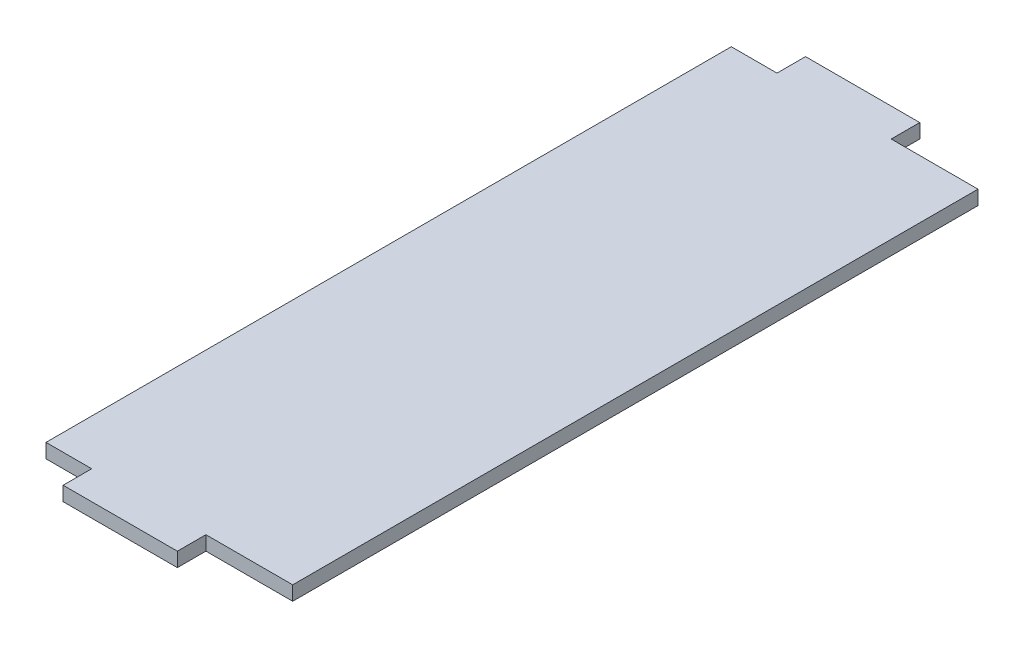
ISO-10303-21;
HEADER;
FILE_DESCRIPTION(('STEP AP214'),'2;1');
FILE_NAME('part.step','',(''),(''),'','','');
FILE_SCHEMA(('AUTOMOTIVE_DESIGN { 1 0 10303 214 1 1 1 1 }'));
ENDSEC;
DATA;
#1=APPLICATION_CONTEXT('core data for automotive mechanical design processes');
#2=APPLICATION_PROTOCOL_DEFINITION('international standard','automotive_design',2000,#1);
#3=PRODUCT_CONTEXT('',#1,'mechanical');
#4=PRODUCT('Part','Part','',(#3));
#5=PRODUCT_RELATED_PRODUCT_CATEGORY('part','',(#4));
#6=PRODUCT_DEFINITION_FORMATION('','',#4);
#7=PRODUCT_DEFINITION_CONTEXT('part definition',#1,'design');
#8=PRODUCT_DEFINITION('design','',#6,#7);
#9=PRODUCT_DEFINITION_SHAPE('','',#8);
#10=(LENGTH_UNIT() NAMED_UNIT(*) SI_UNIT(.MILLI.,.METRE.));
#11=(NAMED_UNIT(*) PLANE_ANGLE_UNIT() SI_UNIT($,.RADIAN.));
#12=(NAMED_UNIT(*) SI_UNIT($,.STERADIAN.) SOLID_ANGLE_UNIT());
#13=UNCERTAINTY_MEASURE_WITH_UNIT(LENGTH_MEASURE(1.E-05),#10,'distance_accuracy_value','');
#14=(GEOMETRIC_REPRESENTATION_CONTEXT(3) GLOBAL_UNCERTAINTY_ASSIGNED_CONTEXT((#13)) GLOBAL_UNIT_ASSIGNED_CONTEXT((#10,
#11,#12)) REPRESENTATION_CONTEXT('',''));
#15=CARTESIAN_POINT('',(0.,0.,0.));
#16=DIRECTION('',(0.,0.,1.));
#17=DIRECTION('',(1.,0.,0.));
#18=AXIS2_PLACEMENT_3D('',#15,#16,#17);
#19=CARTESIAN_POINT('',(0.,1.5875,0.));
#20=DIRECTION('',(0.,0.,-1.));
#21=DIRECTION('',(-1.,0.,0.));
#22=AXIS2_PLACEMENT_3D('',#19,#20,#21);
#23=PLANE('',#22);
#24=DIRECTION('',(1.,0.,0.));
#25=VECTOR('',#24,1.);
#26=CARTESIAN_POINT('',(0.,0.,0.));
#27=LINE('',#26,#25);
#28=CARTESIAN_POINT('',(0.,0.,0.));
#29=VERTEX_POINT('',#28);
#30=CARTESIAN_POINT('',(5.08,0.,0.));
#31=VERTEX_POINT('',#30);
#32=EDGE_CURVE('E154',#29,#31,#27,.T.);
#33=ORIENTED_EDGE('',*,*,#32,.T.);
#34=DIRECTION('',(0.,-1.,0.));
#35=VECTOR('',#34,1.);
#36=CARTESIAN_POINT('',(5.08,1.5875,0.));
#37=LINE('',#36,#35);
#38=CARTESIAN_POINT('',(5.08,1.5875,0.));
#39=VERTEX_POINT('',#38);
#40=EDGE_CURVE('E11',#39,#31,#37,.T.);
#41=ORIENTED_EDGE('',*,*,#40,.F.);
#42=DIRECTION('',(1.,0.,0.));
#43=VECTOR('',#42,1.);
#44=CARTESIAN_POINT('',(0.,1.5875,0.));
#45=LINE('',#44,#43);
#46=CARTESIAN_POINT('',(0.,1.5875,0.));
#47=VERTEX_POINT('',#46);
#48=EDGE_CURVE('E185',#47,#39,#45,.T.);
#49=ORIENTED_EDGE('',*,*,#48,.F.);
#50=DIRECTION('',(0.,-1.,0.));
#51=VECTOR('',#50,1.);
#52=CARTESIAN_POINT('',(0.,1.5875,0.));
#53=LINE('',#52,#51);
#54=EDGE_CURVE('E50',#47,#29,#53,.T.);
#55=ORIENTED_EDGE('',*,*,#54,.T.);
#56=EDGE_LOOP('',(#33,#41,#49,#55));
#57=FACE_BOUND('',#56,.T.);
#58=ADVANCED_FACE('F34',(#57),#23,.F.);
#59=CARTESIAN_POINT('',(5.08,1.5875,0.));
#60=DIRECTION('',(1.,0.,0.));
#61=DIRECTION('',(0.,0.,-1.));
#62=AXIS2_PLACEMENT_3D('',#59,#60,#61);
#63=PLANE('',#62);
#64=DIRECTION('',(0.,0.,1.));
#65=VECTOR('',#64,1.);
#66=CARTESIAN_POINT('',(5.08,0.,0.));
#67=LINE('',#66,#65);
#68=CARTESIAN_POINT('',(5.08,0.,3.175));
#69=VERTEX_POINT('',#68);
#70=EDGE_CURVE('E156',#31,#69,#67,.T.);
#71=ORIENTED_EDGE('',*,*,#70,.T.);
#72=DIRECTION('',(0.,-1.,0.));
#73=VECTOR('',#72,1.);
#74=CARTESIAN_POINT('',(5.08,1.5875,3.175));
#75=LINE('',#74,#73);
#76=CARTESIAN_POINT('',(5.08,1.5875,3.175));
#77=VERTEX_POINT('',#76);
#78=EDGE_CURVE('E42',#77,#69,#75,.T.);
#79=ORIENTED_EDGE('',*,*,#78,.F.);
#80=DIRECTION('',(0.,0.,1.));
#81=VECTOR('',#80,1.);
#82=CARTESIAN_POINT('',(5.08,1.5875,0.));
#83=LINE('',#82,#81);
#84=EDGE_CURVE('E100',#39,#77,#83,.T.);
#85=ORIENTED_EDGE('',*,*,#84,.F.);
#86=ORIENTED_EDGE('',*,*,#40,.T.);
#87=EDGE_LOOP('',(#71,#79,#85,#86));
#88=FACE_BOUND('',#87,.T.);
#89=ADVANCED_FACE('F246',(#88),#63,.F.);
#90=CARTESIAN_POINT('',(0.,1.5875,3.175));
#91=DIRECTION('',(0.,0.,-1.));
#92=DIRECTION('',(-1.,0.,0.));
#93=AXIS2_PLACEMENT_3D('',#90,#91,#92);
#94=PLANE('',#93);
#95=DIRECTION('',(1.,0.,0.));
#96=VECTOR('',#95,1.);
#97=CARTESIAN_POINT('',(0.,0.,3.175));
#98=LINE('',#97,#96);
#99=CARTESIAN_POINT('',(17.78,0.,3.175));
#100=VERTEX_POINT('',#99);
#101=EDGE_CURVE('E158',#69,#100,#98,.T.);
#102=ORIENTED_EDGE('',*,*,#101,.T.);
#103=DIRECTION('',(0.,-1.,0.));
#104=VECTOR('',#103,1.);
#105=CARTESIAN_POINT('',(17.78,1.5875,3.175));
#106=LINE('',#105,#104);
#107=CARTESIAN_POINT('',(17.78,1.5875,3.175));
#108=VERTEX_POINT('',#107);
#109=EDGE_CURVE('E199',#108,#100,#106,.T.);
#110=ORIENTED_EDGE('',*,*,#109,.F.);
#111=DIRECTION('',(1.,0.,0.));
#112=VECTOR('',#111,1.);
#113=CARTESIAN_POINT('',(0.,1.5875,3.175));
#114=LINE('',#113,#112);
#115=EDGE_CURVE('E206',#77,#108,#114,.T.);
#116=ORIENTED_EDGE('',*,*,#115,.F.);
#117=ORIENTED_EDGE('',*,*,#78,.T.);
#118=EDGE_LOOP('',(#102,#110,#116,#117));
#119=FACE_BOUND('',#118,.T.);
#120=ADVANCED_FACE('F204',(#119),#94,.F.);
#121=CARTESIAN_POINT('',(17.78,1.5875,0.));
#122=DIRECTION('',(1.,0.,0.));
#123=DIRECTION('',(0.,0.,-1.));
#124=AXIS2_PLACEMENT_3D('',#121,#122,#123);
#125=PLANE('',#124);
#126=DIRECTION('',(0.,0.,1.));
#127=VECTOR('',#126,1.);
#128=CARTESIAN_POINT('',(17.78,0.,0.));
#129=LINE('',#128,#127);
#130=CARTESIAN_POINT('',(17.78,0.,0.));
#131=VERTEX_POINT('',#130);
#132=EDGE_CURVE('E161',#131,#100,#129,.T.);
#133=ORIENTED_EDGE('',*,*,#132,.F.);
#134=DIRECTION('',(0.,-1.,0.));
#135=VECTOR('',#134,1.);
#136=CARTESIAN_POINT('',(17.78,1.5875,0.));
#137=LINE('',#136,#135);
#138=CARTESIAN_POINT('',(17.78,1.5875,0.));
#139=VERTEX_POINT('',#138);
#140=EDGE_CURVE('E197',#139,#131,#137,.T.);
#141=ORIENTED_EDGE('',*,*,#140,.F.);
#142=DIRECTION('',(0.,0.,1.));
#143=VECTOR('',#142,1.);
#144=CARTESIAN_POINT('',(17.78,1.5875,0.));
#145=LINE('',#144,#143);
#146=EDGE_CURVE('E216',#139,#108,#145,.T.);
#147=ORIENTED_EDGE('',*,*,#146,.T.);
#148=ORIENTED_EDGE('',*,*,#109,.T.);
#149=EDGE_LOOP('',(#133,#141,#147,#148));
#150=FACE_BOUND('',#149,.T.);
#151=ADVANCED_FACE('F212',(#150),#125,.T.);
#152=CARTESIAN_POINT('',(0.,1.5875,0.));
#153=DIRECTION('',(0.,0.,-1.));
#154=DIRECTION('',(-1.,0.,0.));
#155=AXIS2_PLACEMENT_3D('',#152,#153,#154);
#156=PLANE('',#155);
#157=DIRECTION('',(1.,0.,0.));
#158=VECTOR('',#157,1.);
#159=CARTESIAN_POINT('',(0.,0.,0.));
#160=LINE('',#159,#158);
#161=CARTESIAN_POINT('',(27.432,0.,0.));
#162=VERTEX_POINT('',#161);
#163=EDGE_CURVE('E164',#131,#162,#160,.T.);
#164=ORIENTED_EDGE('',*,*,#163,.T.);
#165=DIRECTION('',(0.,-1.,0.));
#166=VECTOR('',#165,1.);
#167=CARTESIAN_POINT('',(27.432,1.5875,0.));
#168=LINE('',#167,#166);
#169=CARTESIAN_POINT('',(27.432,1.5875,0.));
#170=VERTEX_POINT('',#169);
#171=EDGE_CURVE('E195',#170,#162,#168,.T.);
#172=ORIENTED_EDGE('',*,*,#171,.F.);
#173=DIRECTION('',(1.,0.,0.));
#174=VECTOR('',#173,1.);
#175=CARTESIAN_POINT('',(0.,1.5875,0.));
#176=LINE('',#175,#174);
#177=EDGE_CURVE('E217',#139,#170,#176,.T.);
#178=ORIENTED_EDGE('',*,*,#177,.F.);
#179=ORIENTED_EDGE('',*,*,#140,.T.);
#180=EDGE_LOOP('',(#164,#172,#178,#179));
#181=FACE_BOUND('',#180,.T.);
#182=ADVANCED_FACE('F259',(#181),#156,.F.);
#183=CARTESIAN_POINT('',(27.432,1.5875,0.));
#184=DIRECTION('',(1.,0.,0.));
#185=DIRECTION('',(0.,0.,-1.));
#186=AXIS2_PLACEMENT_3D('',#183,#184,#185);
#187=PLANE('',#186);
#188=DIRECTION('',(0.,0.,1.));
#189=VECTOR('',#188,1.);
#190=CARTESIAN_POINT('',(27.432,0.,0.));
#191=LINE('',#190,#189);
#192=CARTESIAN_POINT('',(27.432,0.,-76.2));
#193=VERTEX_POINT('',#192);
#194=EDGE_CURVE('E167',#193,#162,#191,.T.);
#195=ORIENTED_EDGE('',*,*,#194,.F.);
#196=DIRECTION('',(0.,-1.,0.));
#197=VECTOR('',#196,1.);
#198=CARTESIAN_POINT('',(27.432,1.5875,-76.2));
#199=LINE('',#198,#197);
#200=CARTESIAN_POINT('',(27.432,1.5875,-76.2));
#201=VERTEX_POINT('',#200);
#202=EDGE_CURVE('E193',#201,#193,#199,.T.);
#203=ORIENTED_EDGE('',*,*,#202,.F.);
#204=DIRECTION('',(0.,0.,1.));
#205=VECTOR('',#204,1.);
#206=CARTESIAN_POINT('',(27.432,1.5875,0.));
#207=LINE('',#206,#205);
#208=EDGE_CURVE('E219',#201,#170,#207,.T.);
#209=ORIENTED_EDGE('',*,*,#208,.T.);
#210=ORIENTED_EDGE('',*,*,#171,.T.);
#211=EDGE_LOOP('',(#195,#203,#209,#210));
#212=FACE_BOUND('',#211,.T.);
#213=ADVANCED_FACE('F262',(#212),#187,.T.);
#214=CARTESIAN_POINT('',(0.,1.5875,-76.2));
#215=DIRECTION('',(0.,0.,-1.));
#216=DIRECTION('',(-1.,0.,0.));
#217=AXIS2_PLACEMENT_3D('',#214,#215,#216);
#218=PLANE('',#217);
#219=DIRECTION('',(1.,0.,0.));
#220=VECTOR('',#219,1.);
#221=CARTESIAN_POINT('',(0.,0.,-76.2));
#222=LINE('',#221,#220);
#223=CARTESIAN_POINT('',(17.78,0.,-76.2));
#224=VERTEX_POINT('',#223);
#225=EDGE_CURVE('E170',#224,#193,#222,.T.);
#226=ORIENTED_EDGE('',*,*,#225,.F.);
#227=DIRECTION('',(0.,-1.,0.));
#228=VECTOR('',#227,1.);
#229=CARTESIAN_POINT('',(17.78,1.5875,-76.2));
#230=LINE('',#229,#228);
#231=CARTESIAN_POINT('',(17.78,1.5875,-76.2));
#232=VERTEX_POINT('',#231);
#233=EDGE_CURVE('E191',#232,#224,#230,.T.);
#234=ORIENTED_EDGE('',*,*,#233,.F.);
#235=DIRECTION('',(1.,0.,0.));
#236=VECTOR('',#235,1.);
#237=CARTESIAN_POINT('',(0.,1.5875,-76.2));
#238=LINE('',#237,#236);
#239=EDGE_CURVE('E226',#232,#201,#238,.T.);
#240=ORIENTED_EDGE('',*,*,#239,.T.);
#241=ORIENTED_EDGE('',*,*,#202,.T.);
#242=EDGE_LOOP('',(#226,#234,#240,#241));
#243=FACE_BOUND('',#242,.T.);
#244=ADVANCED_FACE('F266',(#243),#218,.T.);
#245=CARTESIAN_POINT('',(17.7800000000003,1.5875,0.));
#246=DIRECTION('',(-1.,0.,0.));
#247=DIRECTION('',(0.,0.,1.));
#248=AXIS2_PLACEMENT_3D('',#245,#246,#247);
#249=PLANE('',#248);
#250=DIRECTION('',(0.,0.,-1.));
#251=VECTOR('',#250,1.);
#252=CARTESIAN_POINT('',(17.7800000000003,0.,0.));
#253=LINE('',#252,#251);
#254=CARTESIAN_POINT('',(17.78,0.,-79.375));
#255=VERTEX_POINT('',#254);
#256=EDGE_CURVE('E173',#224,#255,#253,.T.);
#257=ORIENTED_EDGE('',*,*,#256,.T.);
#258=DIRECTION('',(0.,-1.,0.));
#259=VECTOR('',#258,1.);
#260=CARTESIAN_POINT('',(17.78,1.5875,-79.375));
#261=LINE('',#260,#259);
#262=CARTESIAN_POINT('',(17.78,1.5875,-79.375));
#263=VERTEX_POINT('',#262);
#264=EDGE_CURVE('E189',#263,#255,#261,.T.);
#265=ORIENTED_EDGE('',*,*,#264,.F.);
#266=DIRECTION('',(0.,0.,-1.));
#267=VECTOR('',#266,1.);
#268=CARTESIAN_POINT('',(17.7800000000003,1.5875,0.));
#269=LINE('',#268,#267);
#270=EDGE_CURVE('E229',#232,#263,#269,.T.);
#271=ORIENTED_EDGE('',*,*,#270,.F.);
#272=ORIENTED_EDGE('',*,*,#233,.T.);
#273=EDGE_LOOP('',(#257,#265,#271,#272));
#274=FACE_BOUND('',#273,.T.);
#275=ADVANCED_FACE('F270',(#274),#249,.F.);
#276=CARTESIAN_POINT('',(0.,1.5875,-79.375));
#277=DIRECTION('',(0.,0.,-1.));
#278=DIRECTION('',(-1.,0.,0.));
#279=AXIS2_PLACEMENT_3D('',#276,#277,#278);
#280=PLANE('',#279);
#281=DIRECTION('',(1.,0.,0.));
#282=VECTOR('',#281,1.);
#283=CARTESIAN_POINT('',(0.,0.,-79.375));
#284=LINE('',#283,#282);
#285=CARTESIAN_POINT('',(5.08,0.,-79.375));
#286=VERTEX_POINT('',#285);
#287=EDGE_CURVE('E176',#286,#255,#284,.T.);
#288=ORIENTED_EDGE('',*,*,#287,.F.);
#289=DIRECTION('',(0.,-1.,0.));
#290=VECTOR('',#289,1.);
#291=CARTESIAN_POINT('',(5.08,1.5875,-79.375));
#292=LINE('',#291,#290);
#293=CARTESIAN_POINT('',(5.08,1.5875,-79.375));
#294=VERTEX_POINT('',#293);
#295=EDGE_CURVE('E137',#294,#286,#292,.T.);
#296=ORIENTED_EDGE('',*,*,#295,.F.);
#297=DIRECTION('',(1.,0.,0.));
#298=VECTOR('',#297,1.);
#299=CARTESIAN_POINT('',(0.,1.5875,-79.375));
#300=LINE('',#299,#298);
#301=EDGE_CURVE('E146',#294,#263,#300,.T.);
#302=ORIENTED_EDGE('',*,*,#301,.T.);
#303=ORIENTED_EDGE('',*,*,#264,.T.);
#304=EDGE_LOOP('',(#288,#296,#302,#303));
#305=FACE_BOUND('',#304,.T.);
#306=ADVANCED_FACE('F232',(#305),#280,.T.);
#307=CARTESIAN_POINT('',(5.08000000000002,1.5875,0.));
#308=DIRECTION('',(-1.,0.,0.));
#309=DIRECTION('',(0.,0.,1.));
#310=AXIS2_PLACEMENT_3D('',#307,#308,#309);
#311=PLANE('',#310);
#312=DIRECTION('',(0.,0.,-1.));
#313=VECTOR('',#312,1.);
#314=CARTESIAN_POINT('',(5.08000000000002,0.,0.));
#315=LINE('',#314,#313);
#316=CARTESIAN_POINT('',(5.08,0.,-76.2));
#317=VERTEX_POINT('',#316);
#318=EDGE_CURVE('E133',#317,#286,#315,.T.);
#319=ORIENTED_EDGE('',*,*,#318,.F.);
#320=DIRECTION('',(0.,-1.,0.));
#321=VECTOR('',#320,1.);
#322=CARTESIAN_POINT('',(5.08,1.5875,-76.2));
#323=LINE('',#322,#321);
#324=CARTESIAN_POINT('',(5.08,1.5875,-76.2));
#325=VERTEX_POINT('',#324);
#326=EDGE_CURVE('E128',#325,#317,#323,.T.);
#327=ORIENTED_EDGE('',*,*,#326,.F.);
#328=DIRECTION('',(0.,0.,-1.));
#329=VECTOR('',#328,1.);
#330=CARTESIAN_POINT('',(5.08000000000002,1.5875,0.));
#331=LINE('',#330,#329);
#332=EDGE_CURVE('E131',#325,#294,#331,.T.);
#333=ORIENTED_EDGE('',*,*,#332,.T.);
#334=ORIENTED_EDGE('',*,*,#295,.T.);
#335=EDGE_LOOP('',(#319,#327,#333,#334));
#336=FACE_BOUND('',#335,.T.);
#337=ADVANCED_FACE('F130',(#336),#311,.T.);
#338=CARTESIAN_POINT('',(0.,1.5875,-76.2));
#339=DIRECTION('',(0.,0.,-1.));
#340=DIRECTION('',(-1.,0.,0.));
#341=AXIS2_PLACEMENT_3D('',#338,#339,#340);
#342=PLANE('',#341);
#343=DIRECTION('',(1.,0.,0.));
#344=VECTOR('',#343,1.);
#345=CARTESIAN_POINT('',(0.,0.,-76.2));
#346=LINE('',#345,#344);
#347=CARTESIAN_POINT('',(0.,0.,-76.2));
#348=VERTEX_POINT('',#347);
#349=EDGE_CURVE('E180',#348,#317,#346,.T.);
#350=ORIENTED_EDGE('',*,*,#349,.F.);
#351=DIRECTION('',(0.,-1.,0.));
#352=VECTOR('',#351,1.);
#353=CARTESIAN_POINT('',(0.,1.5875,-76.2));
#354=LINE('',#353,#352);
#355=CARTESIAN_POINT('',(0.,1.5875,-76.2));
#356=VERTEX_POINT('',#355);
#357=EDGE_CURVE('E88',#356,#348,#354,.T.);
#358=ORIENTED_EDGE('',*,*,#357,.F.);
#359=DIRECTION('',(1.,0.,0.));
#360=VECTOR('',#359,1.);
#361=CARTESIAN_POINT('',(0.,1.5875,-76.2));
#362=LINE('',#361,#360);
#363=EDGE_CURVE('E144',#356,#325,#362,.T.);
#364=ORIENTED_EDGE('',*,*,#363,.T.);
#365=ORIENTED_EDGE('',*,*,#326,.T.);
#366=EDGE_LOOP('',(#350,#358,#364,#365));
#367=FACE_BOUND('',#366,.T.);
#368=ADVANCED_FACE('F148',(#367),#342,.T.);
#369=CARTESIAN_POINT('',(0.,1.5875,0.));
#370=DIRECTION('',(-1.,0.,0.));
#371=DIRECTION('',(0.,0.,1.));
#372=AXIS2_PLACEMENT_3D('',#369,#370,#371);
#373=PLANE('',#372);
#374=DIRECTION('',(0.,0.,-1.));
#375=VECTOR('',#374,1.);
#376=CARTESIAN_POINT('',(0.,0.,0.));
#377=LINE('',#376,#375);
#378=EDGE_CURVE('E182',#29,#348,#377,.T.);
#379=ORIENTED_EDGE('',*,*,#378,.F.);
#380=ORIENTED_EDGE('',*,*,#54,.F.);
#381=DIRECTION('',(0.,0.,-1.));
#382=VECTOR('',#381,1.);
#383=CARTESIAN_POINT('',(0.,1.5875,0.));
#384=LINE('',#383,#382);
#385=EDGE_CURVE('E149',#47,#356,#384,.T.);
#386=ORIENTED_EDGE('',*,*,#385,.T.);
#387=ORIENTED_EDGE('',*,*,#357,.T.);
#388=EDGE_LOOP('',(#379,#380,#386,#387));
#389=FACE_BOUND('',#388,.T.);
#390=ADVANCED_FACE('F235',(#389),#373,.T.);
#391=CARTESIAN_POINT('',(0.,1.5875,0.));
#392=DIRECTION('',(0.,1.,0.));
#393=DIRECTION('',(0.,0.,1.));
#394=AXIS2_PLACEMENT_3D('',#391,#392,#393);
#395=PLANE('',#394);
#396=ORIENTED_EDGE('',*,*,#48,.T.);
#397=ORIENTED_EDGE('',*,*,#84,.T.);
#398=ORIENTED_EDGE('',*,*,#115,.T.);
#399=ORIENTED_EDGE('',*,*,#146,.F.);
#400=ORIENTED_EDGE('',*,*,#177,.T.);
#401=ORIENTED_EDGE('',*,*,#208,.F.);
#402=ORIENTED_EDGE('',*,*,#239,.F.);
#403=ORIENTED_EDGE('',*,*,#270,.T.);
#404=ORIENTED_EDGE('',*,*,#301,.F.);
#405=ORIENTED_EDGE('',*,*,#332,.F.);
#406=ORIENTED_EDGE('',*,*,#363,.F.);
#407=ORIENTED_EDGE('',*,*,#385,.F.);
#408=EDGE_LOOP('',(#396,#397,#398,#399,#400,#401,#402,#403,#404,#405,#406,#407));
#409=FACE_BOUND('',#408,.T.);
#410=ADVANCED_FACE('F142',(#409),#395,.T.);
#411=CARTESIAN_POINT('',(0.,0.,0.));
#412=DIRECTION('',(0.,1.,0.));
#413=DIRECTION('',(0.,0.,1.));
#414=AXIS2_PLACEMENT_3D('',#411,#412,#413);
#415=PLANE('',#414);
#416=ORIENTED_EDGE('',*,*,#32,.F.);
#417=ORIENTED_EDGE('',*,*,#378,.T.);
#418=ORIENTED_EDGE('',*,*,#349,.T.);
#419=ORIENTED_EDGE('',*,*,#318,.T.);
#420=ORIENTED_EDGE('',*,*,#287,.T.);
#421=ORIENTED_EDGE('',*,*,#256,.F.);
#422=ORIENTED_EDGE('',*,*,#225,.T.);
#423=ORIENTED_EDGE('',*,*,#194,.T.);
#424=ORIENTED_EDGE('',*,*,#163,.F.);
#425=ORIENTED_EDGE('',*,*,#132,.T.);
#426=ORIENTED_EDGE('',*,*,#101,.F.);
#427=ORIENTED_EDGE('',*,*,#70,.F.);
#428=EDGE_LOOP('',(#416,#417,#418,#419,#420,#421,#422,#423,#424,#425,#426,#427));
#429=FACE_BOUND('',#428,.T.);
#430=ADVANCED_FACE('F208',(#429),#415,.F.);
#431=CLOSED_SHELL('',(#58,#89,#120,#151,#182,#213,#244,#275,#306,#337,#368,#390,#410,#430));
#432=MANIFOLD_SOLID_BREP('B2',#431);
#433=ADVANCED_BREP_SHAPE_REPRESENTATION('',(#18,#432),#14);
#434=SHAPE_DEFINITION_REPRESENTATION(#9,#433);
ENDSEC;
END-ISO-10303-21;
